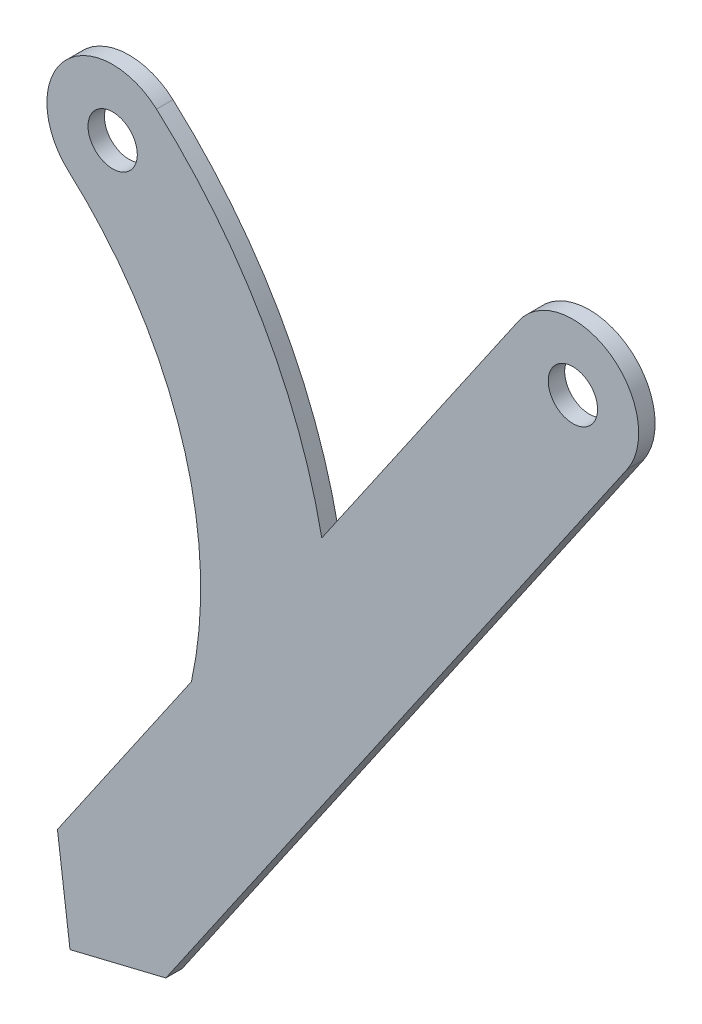
ISO-10303-21;
HEADER;
FILE_DESCRIPTION(('STEP AP214'),'2;1');
FILE_NAME('part.step','',(''),(''),'','','');
FILE_SCHEMA(('AUTOMOTIVE_DESIGN { 1 0 10303 214 1 1 1 1 }'));
ENDSEC;
DATA;
#1=APPLICATION_CONTEXT('core data for automotive mechanical design processes');
#2=APPLICATION_PROTOCOL_DEFINITION('international standard','automotive_design',2000,#1);
#3=PRODUCT_CONTEXT('',#1,'mechanical');
#4=PRODUCT('Part','Part','',(#3));
#5=PRODUCT_RELATED_PRODUCT_CATEGORY('part','',(#4));
#6=PRODUCT_DEFINITION_FORMATION('','',#4);
#7=PRODUCT_DEFINITION_CONTEXT('part definition',#1,'design');
#8=PRODUCT_DEFINITION('design','',#6,#7);
#9=PRODUCT_DEFINITION_SHAPE('','',#8);
#10=(LENGTH_UNIT() NAMED_UNIT(*) SI_UNIT(.MILLI.,.METRE.));
#11=(NAMED_UNIT(*) PLANE_ANGLE_UNIT() SI_UNIT($,.RADIAN.));
#12=(NAMED_UNIT(*) SI_UNIT($,.STERADIAN.) SOLID_ANGLE_UNIT());
#13=UNCERTAINTY_MEASURE_WITH_UNIT(LENGTH_MEASURE(1.E-05),#10,'distance_accuracy_value','');
#14=(GEOMETRIC_REPRESENTATION_CONTEXT(3) GLOBAL_UNCERTAINTY_ASSIGNED_CONTEXT((#13)) GLOBAL_UNIT_ASSIGNED_CONTEXT((#10,
#11,#12)) REPRESENTATION_CONTEXT('',''));
#15=CARTESIAN_POINT('',(0.,0.,0.));
#16=DIRECTION('',(0.,0.,1.));
#17=DIRECTION('',(1.,0.,0.));
#18=AXIS2_PLACEMENT_3D('',#15,#16,#17);
#19=CARTESIAN_POINT('',(18.1283077153022,-75.5243674665704,-1.));
#20=DIRECTION('',(0.236602034156304,-0.971606647482971,0.));
#21=DIRECTION('',(0.971606647482972,0.236602034156304,0.));
#22=AXIS2_PLACEMENT_3D('',#19,#20,#21);
#23=PLANE('',#22);
#24=DIRECTION('',(0.971606647482971,0.236602034156304,0.));
#25=VECTOR('',#24,1.);
#26=CARTESIAN_POINT('',(18.1283077153022,-75.5243674665704,0.));
#27=LINE('',#26,#25);
#28=CARTESIAN_POINT('',(18.1283077153022,-75.5243674665704,0.));
#29=VERTEX_POINT('',#28);
#30=CARTESIAN_POINT('',(23.9579476002001,-74.1047552616325,0.));
#31=VERTEX_POINT('',#30);
#32=EDGE_CURVE('E144',#29,#31,#27,.T.);
#33=ORIENTED_EDGE('',*,*,#32,.F.);
#34=DIRECTION('',(0.,0.,1.));
#35=VECTOR('',#34,1.);
#36=CARTESIAN_POINT('',(18.1283077153022,-75.5243674665704,-1.));
#37=LINE('',#36,#35);
#38=CARTESIAN_POINT('',(18.1283077153022,-75.5243674665704,-1.));
#39=VERTEX_POINT('',#38);
#40=EDGE_CURVE('E11',#39,#29,#37,.T.);
#41=ORIENTED_EDGE('',*,*,#40,.F.);
#42=DIRECTION('',(0.971606647482971,0.236602034156304,0.));
#43=VECTOR('',#42,1.);
#44=CARTESIAN_POINT('',(18.1283077153022,-75.5243674665704,-1.));
#45=LINE('',#44,#43);
#46=CARTESIAN_POINT('',(23.9579476002001,-74.1047552616325,-1.));
#47=VERTEX_POINT('',#46);
#48=EDGE_CURVE('E168',#39,#47,#45,.T.);
#49=ORIENTED_EDGE('',*,*,#48,.T.);
#50=DIRECTION('',(0.,0.,1.));
#51=VECTOR('',#50,1.);
#52=CARTESIAN_POINT('',(23.9579476002001,-74.1047552616325,-1.));
#53=LINE('',#52,#51);
#54=EDGE_CURVE('E44',#47,#31,#53,.T.);
#55=ORIENTED_EDGE('',*,*,#54,.T.);
#56=EDGE_LOOP('',(#33,#41,#49,#55));
#57=FACE_BOUND('',#56,.T.);
#58=ADVANCED_FACE('F41',(#57),#23,.T.);
#59=CARTESIAN_POINT('',(18.1283077153022,-75.5243674665704,-1.));
#60=DIRECTION('',(-0.991879564311857,-0.127180697829984,0.));
#61=DIRECTION('',(0.127180697829984,-0.991879564311857,0.));
#62=AXIS2_PLACEMENT_3D('',#59,#60,#61);
#63=PLANE('',#62);
#64=DIRECTION('',(0.127180697829984,-0.991879564311856,0.));
#65=VECTOR('',#64,1.);
#66=CARTESIAN_POINT('',(18.1283077153022,-75.5243674665704,0.));
#67=LINE('',#66,#65);
#68=CARTESIAN_POINT('',(17.3652235283223,-69.5730900806992,0.));
#69=VERTEX_POINT('',#68);
#70=EDGE_CURVE('E166',#69,#29,#67,.T.);
#71=ORIENTED_EDGE('',*,*,#70,.F.);
#72=DIRECTION('',(0.,0.,1.));
#73=VECTOR('',#72,1.);
#74=CARTESIAN_POINT('',(17.3652235283223,-69.5730900806992,-1.));
#75=LINE('',#74,#73);
#76=CARTESIAN_POINT('',(17.3652235283223,-69.5730900806992,-1.));
#77=VERTEX_POINT('',#76);
#78=EDGE_CURVE('E50',#77,#69,#75,.T.);
#79=ORIENTED_EDGE('',*,*,#78,.F.);
#80=DIRECTION('',(0.127180697829984,-0.991879564311856,0.));
#81=VECTOR('',#80,1.);
#82=CARTESIAN_POINT('',(18.1283077153022,-75.5243674665704,-1.));
#83=LINE('',#82,#81);
#84=EDGE_CURVE('E134',#77,#39,#83,.T.);
#85=ORIENTED_EDGE('',*,*,#84,.T.);
#86=ORIENTED_EDGE('',*,*,#40,.T.);
#87=EDGE_LOOP('',(#71,#79,#85,#86));
#88=FACE_BOUND('',#87,.T.);
#89=ADVANCED_FACE('F182',(#88),#63,.T.);
#90=CARTESIAN_POINT('',(25.5132162915034,-57.7192867032294,-1.));
#91=DIRECTION('',(-0.824090508984721,0.566458147616666,0.));
#92=DIRECTION('',(-0.566458147616666,-0.824090508984721,0.));
#93=AXIS2_PLACEMENT_3D('',#90,#91,#92);
#94=PLANE('',#93);
#95=DIRECTION('',(-0.566458147616666,-0.824090508984721,0.));
#96=VECTOR('',#95,1.);
#97=CARTESIAN_POINT('',(25.5132162915034,-57.7192867032294,0.));
#98=LINE('',#97,#96);
#99=CARTESIAN_POINT('',(25.5132162915034,-57.7192867032294,0.));
#100=VERTEX_POINT('',#99);
#101=EDGE_CURVE('E121',#100,#69,#98,.T.);
#102=ORIENTED_EDGE('',*,*,#101,.F.);
#103=DIRECTION('',(0.,0.,1.));
#104=VECTOR('',#103,1.);
#105=CARTESIAN_POINT('',(25.5132162915034,-57.7192867032294,-1.));
#106=LINE('',#105,#104);
#107=CARTESIAN_POINT('',(25.5132162915034,-57.7192867032294,-1.));
#108=VERTEX_POINT('',#107);
#109=EDGE_CURVE('E116',#108,#100,#106,.T.);
#110=ORIENTED_EDGE('',*,*,#109,.F.);
#111=DIRECTION('',(-0.566458147616666,-0.824090508984721,0.));
#112=VECTOR('',#111,1.);
#113=CARTESIAN_POINT('',(25.5132162915034,-57.7192867032294,-1.));
#114=LINE('',#113,#112);
#115=EDGE_CURVE('E119',#108,#77,#114,.T.);
#116=ORIENTED_EDGE('',*,*,#115,.T.);
#117=ORIENTED_EDGE('',*,*,#78,.T.);
#118=EDGE_LOOP('',(#102,#110,#116,#117));
#119=FACE_BOUND('',#118,.T.);
#120=ADVANCED_FACE('F118',(#119),#94,.T.);
#121=CARTESIAN_POINT('',(1.98443797205253,-52.5323456658369,-1.));
#122=DIRECTION('',(0.,0.,1.));
#123=DIRECTION('',(1.,0.,0.));
#124=AXIS2_PLACEMENT_3D('',#121,#122,#123);
#125=CYLINDRICAL_SURFACE('',#124,24.0937287801462);
#126=CARTESIAN_POINT('',(1.98443797205253,-52.5323456658369,0.));
#127=DIRECTION('',(0.,0.,-1.));
#128=DIRECTION('',(1.,0.,0.));
#129=AXIS2_PLACEMENT_3D('',#126,#127,#128);
#130=CIRCLE('',#129,24.0937287801462);
#131=CARTESIAN_POINT('',(18.0549961293088,-34.5811638928869,0.));
#132=VERTEX_POINT('',#131);
#133=EDGE_CURVE('E163',#132,#100,#130,.T.);
#134=ORIENTED_EDGE('',*,*,#133,.F.);
#135=DIRECTION('',(0.,0.,1.));
#136=VECTOR('',#135,1.);
#137=CARTESIAN_POINT('',(18.0549961293088,-34.5811638928869,-1.));
#138=LINE('',#137,#136);
#139=CARTESIAN_POINT('',(18.0549961293088,-34.5811638928869,-1.));
#140=VERTEX_POINT('',#139);
#141=EDGE_CURVE('E126',#140,#132,#138,.T.);
#142=ORIENTED_EDGE('',*,*,#141,.F.);
#143=CARTESIAN_POINT('',(1.98443797205253,-52.5323456658369,-1.));
#144=DIRECTION('',(0.,0.,-1.));
#145=DIRECTION('',(1.,0.,0.));
#146=AXIS2_PLACEMENT_3D('',#143,#144,#145);
#147=CIRCLE('',#146,24.0937287801462);
#148=EDGE_CURVE('E132',#140,#108,#147,.T.);
#149=ORIENTED_EDGE('',*,*,#148,.T.);
#150=ORIENTED_EDGE('',*,*,#109,.T.);
#151=EDGE_LOOP('',(#134,#142,#149,#150));
#152=FACE_BOUND('',#151,.T.);
#153=ADVANCED_FACE('F136',(#152),#125,.F.);
#154=CARTESIAN_POINT('',(20.7230029461696,-31.6009391320367,-1.));
#155=DIRECTION('',(0.,0.,1.));
#156=DIRECTION('',(1.,0.,0.));
#157=AXIS2_PLACEMENT_3D('',#154,#155,#156);
#158=CYLINDRICAL_SURFACE('',#157,4.);
#159=CARTESIAN_POINT('',(20.7230029461696,-31.6009391320367,0.));
#160=DIRECTION('',(0.,0.,1.));
#161=DIRECTION('',(1.,0.,0.));
#162=AXIS2_PLACEMENT_3D('',#159,#160,#161);
#163=CIRCLE('',#162,4.);
#164=CARTESIAN_POINT('',(23.3910097630304,-28.6207143711865,0.));
#165=VERTEX_POINT('',#164);
#166=EDGE_CURVE('E160',#165,#132,#163,.T.);
#167=ORIENTED_EDGE('',*,*,#166,.F.);
#168=DIRECTION('',(0.,0.,1.));
#169=VECTOR('',#168,1.);
#170=CARTESIAN_POINT('',(23.3910097630304,-28.6207143711865,-1.));
#171=LINE('',#170,#169);
#172=CARTESIAN_POINT('',(23.3910097630304,-28.6207143711865,-1.));
#173=VERTEX_POINT('',#172);
#174=EDGE_CURVE('E172',#173,#165,#171,.T.);
#175=ORIENTED_EDGE('',*,*,#174,.F.);
#176=CARTESIAN_POINT('',(20.7230029461696,-31.6009391320367,-1.));
#177=DIRECTION('',(0.,0.,1.));
#178=DIRECTION('',(1.,0.,0.));
#179=AXIS2_PLACEMENT_3D('',#176,#177,#178);
#180=CIRCLE('',#179,4.);
#181=EDGE_CURVE('E137',#173,#140,#180,.T.);
#182=ORIENTED_EDGE('',*,*,#181,.T.);
#183=ORIENTED_EDGE('',*,*,#141,.T.);
#184=EDGE_LOOP('',(#167,#175,#182,#183));
#185=FACE_BOUND('',#184,.T.);
#186=ADVANCED_FACE('F195',(#185),#158,.T.);
#187=CARTESIAN_POINT('',(1.98443797205253,-52.5323456658369,-1.));
#188=DIRECTION('',(0.,0.,1.));
#189=DIRECTION('',(1.,0.,0.));
#190=AXIS2_PLACEMENT_3D('',#187,#188,#189);
#191=CYLINDRICAL_SURFACE('',#190,32.0937287801462);
#192=CARTESIAN_POINT('',(1.98443797205253,-52.5323456658369,0.));
#193=DIRECTION('',(0.,0.,1.));
#194=DIRECTION('',(1.,0.,0.));
#195=AXIS2_PLACEMENT_3D('',#192,#193,#194);
#196=CIRCLE('',#195,32.0937287801462);
#197=CARTESIAN_POINT('',(33.4436303581367,-46.1820195774433,0.));
#198=VERTEX_POINT('',#197);
#199=EDGE_CURVE('E157',#198,#165,#196,.T.);
#200=ORIENTED_EDGE('',*,*,#199,.F.);
#201=DIRECTION('',(0.,0.,1.));
#202=VECTOR('',#201,1.);
#203=CARTESIAN_POINT('',(33.4436303581367,-46.1820195774433,-1.));
#204=LINE('',#203,#202);
#205=CARTESIAN_POINT('',(33.4436303581367,-46.1820195774433,-1.));
#206=VERTEX_POINT('',#205);
#207=EDGE_CURVE('E174',#206,#198,#204,.T.);
#208=ORIENTED_EDGE('',*,*,#207,.F.);
#209=CARTESIAN_POINT('',(1.98443797205253,-52.5323456658369,-1.));
#210=DIRECTION('',(0.,0.,1.));
#211=DIRECTION('',(1.,0.,0.));
#212=AXIS2_PLACEMENT_3D('',#209,#210,#211);
#213=CIRCLE('',#212,32.0937287801462);
#214=EDGE_CURVE('E139',#206,#173,#213,.T.);
#215=ORIENTED_EDGE('',*,*,#214,.T.);
#216=ORIENTED_EDGE('',*,*,#174,.T.);
#217=EDGE_LOOP('',(#200,#208,#215,#216));
#218=FACE_BOUND('',#217,.T.);
#219=ADVANCED_FACE('F198',(#218),#191,.T.);
#220=CARTESIAN_POINT('',(45.4206856506633,-28.7576473909288,-1.));
#221=DIRECTION('',(-0.824090508984721,0.566458147616665,0.));
#222=DIRECTION('',(-0.566458147616665,-0.824090508984721,0.));
#223=AXIS2_PLACEMENT_3D('',#220,#221,#222);
#224=PLANE('',#223);
#225=DIRECTION('',(-0.566458147616665,-0.824090508984721,0.));
#226=VECTOR('',#225,1.);
#227=CARTESIAN_POINT('',(45.4206856506633,-28.7576473909288,0.));
#228=LINE('',#227,#226);
#229=CARTESIAN_POINT('',(45.4206856506633,-28.7576473909288,0.));
#230=VERTEX_POINT('',#229);
#231=EDGE_CURVE('E154',#230,#198,#228,.T.);
#232=ORIENTED_EDGE('',*,*,#231,.F.);
#233=DIRECTION('',(0.,0.,1.));
#234=VECTOR('',#233,1.);
#235=CARTESIAN_POINT('',(45.4206856506633,-28.7576473909288,-1.));
#236=LINE('',#235,#234);
#237=CARTESIAN_POINT('',(45.4206856506633,-28.7576473909288,-1.));
#238=VERTEX_POINT('',#237);
#239=EDGE_CURVE('E176',#238,#230,#236,.T.);
#240=ORIENTED_EDGE('',*,*,#239,.F.);
#241=DIRECTION('',(-0.566458147616665,-0.824090508984721,0.));
#242=VECTOR('',#241,1.);
#243=CARTESIAN_POINT('',(45.4206856506633,-28.7576473909288,-1.));
#244=LINE('',#243,#242);
#245=EDGE_CURVE('E251',#238,#206,#244,.T.);
#246=ORIENTED_EDGE('',*,*,#245,.T.);
#247=ORIENTED_EDGE('',*,*,#207,.T.);
#248=EDGE_LOOP('',(#232,#240,#246,#247));
#249=FACE_BOUND('',#248,.T.);
#250=ADVANCED_FACE('F202',(#249),#224,.T.);
#251=CARTESIAN_POINT('',(48.7170476866022,-31.0234799813955,-1.));
#252=DIRECTION('',(0.,0.,1.));
#253=DIRECTION('',(1.,0.,0.));
#254=AXIS2_PLACEMENT_3D('',#251,#252,#253);
#255=CYLINDRICAL_SURFACE('',#254,4.);
#256=CARTESIAN_POINT('',(48.7170476866022,-31.0234799813955,0.));
#257=DIRECTION('',(0.,0.,1.));
#258=DIRECTION('',(1.,0.,0.));
#259=AXIS2_PLACEMENT_3D('',#256,#257,#258);
#260=CIRCLE('',#259,4.);
#261=CARTESIAN_POINT('',(52.0134097225411,-33.2893125718621,0.));
#262=VERTEX_POINT('',#261);
#263=EDGE_CURVE('E151',#262,#230,#260,.T.);
#264=ORIENTED_EDGE('',*,*,#263,.F.);
#265=DIRECTION('',(0.,0.,1.));
#266=VECTOR('',#265,1.);
#267=CARTESIAN_POINT('',(52.0134097225411,-33.2893125718621,-1.));
#268=LINE('',#267,#266);
#269=CARTESIAN_POINT('',(52.0134097225411,-33.2893125718621,-1.));
#270=VERTEX_POINT('',#269);
#271=EDGE_CURVE('E177',#270,#262,#268,.T.);
#272=ORIENTED_EDGE('',*,*,#271,.F.);
#273=CARTESIAN_POINT('',(48.7170476866022,-31.0234799813955,-1.));
#274=DIRECTION('',(0.,0.,1.));
#275=DIRECTION('',(1.,0.,0.));
#276=AXIS2_PLACEMENT_3D('',#273,#274,#275);
#277=CIRCLE('',#276,4.);
#278=EDGE_CURVE('E248',#270,#238,#277,.T.);
#279=ORIENTED_EDGE('',*,*,#278,.T.);
#280=ORIENTED_EDGE('',*,*,#239,.T.);
#281=EDGE_LOOP('',(#264,#272,#279,#280));
#282=FACE_BOUND('',#281,.T.);
#283=ADVANCED_FACE('F206',(#282),#255,.T.);
#284=CARTESIAN_POINT('',(52.013409722541,-33.2893125718621,-1.));
#285=DIRECTION('',(0.824090508984721,-0.566458147616666,0.));
#286=DIRECTION('',(0.566458147616666,0.824090508984721,0.));
#287=AXIS2_PLACEMENT_3D('',#284,#285,#286);
#288=PLANE('',#287);
#289=DIRECTION('',(0.566458147616666,0.824090508984721,0.));
#290=VECTOR('',#289,1.);
#291=CARTESIAN_POINT('',(52.013409722541,-33.2893125718621,0.));
#292=LINE('',#291,#290);
#293=EDGE_CURVE('E147',#31,#262,#292,.T.);
#294=ORIENTED_EDGE('',*,*,#293,.F.);
#295=ORIENTED_EDGE('',*,*,#54,.F.);
#296=DIRECTION('',(0.566458147616666,0.824090508984721,0.));
#297=VECTOR('',#296,1.);
#298=CARTESIAN_POINT('',(52.013409722541,-33.2893125718621,-1.));
#299=LINE('',#298,#297);
#300=EDGE_CURVE('E246',#47,#270,#299,.T.);
#301=ORIENTED_EDGE('',*,*,#300,.T.);
#302=ORIENTED_EDGE('',*,*,#271,.T.);
#303=EDGE_LOOP('',(#294,#295,#301,#302));
#304=FACE_BOUND('',#303,.T.);
#305=ADVANCED_FACE('F179',(#304),#288,.T.);
#306=CARTESIAN_POINT('',(48.7170476866022,-31.0234799813955,-1.));
#307=DIRECTION('',(0.,0.,1.));
#308=DIRECTION('',(1.,0.,0.));
#309=AXIS2_PLACEMENT_3D('',#306,#307,#308);
#310=PLANE('',#309);
#311=CARTESIAN_POINT('',(48.7170476866022,-31.0234799813955,-1.));
#312=DIRECTION('',(0.,0.,1.));
#313=DIRECTION('',(1.,0.,0.));
#314=AXIS2_PLACEMENT_3D('',#311,#312,#313);
#315=CIRCLE('',#314,1.5);
#316=CARTESIAN_POINT('',(50.2170476866022,-31.0234799813955,-1.));
#317=VERTEX_POINT('',#316);
#318=EDGE_CURVE('E233',#317,#317,#315,.T.);
#319=ORIENTED_EDGE('',*,*,#318,.T.);
#320=EDGE_LOOP('',(#319));
#321=FACE_BOUND('',#320,.T.);
#322=CARTESIAN_POINT('',(20.7230029461696,-31.6009391320367,-1.));
#323=DIRECTION('',(0.,0.,1.));
#324=DIRECTION('',(1.,0.,0.));
#325=AXIS2_PLACEMENT_3D('',#322,#323,#324);
#326=CIRCLE('',#325,1.50000000000001);
#327=CARTESIAN_POINT('',(22.2230029461696,-31.6009391320367,-1.));
#328=VERTEX_POINT('',#327);
#329=EDGE_CURVE('E148',#328,#328,#326,.T.);
#330=ORIENTED_EDGE('',*,*,#329,.T.);
#331=EDGE_LOOP('',(#330));
#332=FACE_BOUND('',#331,.T.);
#333=ORIENTED_EDGE('',*,*,#48,.F.);
#334=ORIENTED_EDGE('',*,*,#84,.F.);
#335=ORIENTED_EDGE('',*,*,#115,.F.);
#336=ORIENTED_EDGE('',*,*,#148,.F.);
#337=ORIENTED_EDGE('',*,*,#181,.F.);
#338=ORIENTED_EDGE('',*,*,#214,.F.);
#339=ORIENTED_EDGE('',*,*,#245,.F.);
#340=ORIENTED_EDGE('',*,*,#278,.F.);
#341=ORIENTED_EDGE('',*,*,#300,.F.);
#342=EDGE_LOOP('',(#333,#334,#335,#336,#337,#338,#339,#340,#341));
#343=FACE_BOUND('',#342,.T.);
#344=ADVANCED_FACE('F130',(#321,#332,#343),#310,.F.);
#345=CARTESIAN_POINT('',(48.7170476866022,-31.0234799813955,0.));
#346=DIRECTION('',(0.,0.,1.));
#347=DIRECTION('',(1.,0.,0.));
#348=AXIS2_PLACEMENT_3D('',#345,#346,#347);
#349=PLANE('',#348);
#350=CARTESIAN_POINT('',(48.7170476866022,-31.0234799813955,0.));
#351=DIRECTION('',(0.,0.,1.));
#352=DIRECTION('',(1.,0.,0.));
#353=AXIS2_PLACEMENT_3D('',#350,#351,#352);
#354=CIRCLE('',#353,1.5);
#355=CARTESIAN_POINT('',(50.2170476866022,-31.0234799813955,0.));
#356=VERTEX_POINT('',#355);
#357=EDGE_CURVE('E236',#356,#356,#354,.T.);
#358=ORIENTED_EDGE('',*,*,#357,.F.);
#359=EDGE_LOOP('',(#358));
#360=FACE_BOUND('',#359,.T.);
#361=CARTESIAN_POINT('',(20.7230029461696,-31.6009391320367,0.));
#362=DIRECTION('',(0.,0.,1.));
#363=DIRECTION('',(1.,0.,0.));
#364=AXIS2_PLACEMENT_3D('',#361,#362,#363);
#365=CIRCLE('',#364,1.50000000000001);
#366=CARTESIAN_POINT('',(22.2230029461696,-31.6009391320367,0.));
#367=VERTEX_POINT('',#366);
#368=EDGE_CURVE('E238',#367,#367,#365,.T.);
#369=ORIENTED_EDGE('',*,*,#368,.F.);
#370=EDGE_LOOP('',(#369));
#371=FACE_BOUND('',#370,.T.);
#372=ORIENTED_EDGE('',*,*,#32,.T.);
#373=ORIENTED_EDGE('',*,*,#293,.T.);
#374=ORIENTED_EDGE('',*,*,#263,.T.);
#375=ORIENTED_EDGE('',*,*,#231,.T.);
#376=ORIENTED_EDGE('',*,*,#199,.T.);
#377=ORIENTED_EDGE('',*,*,#166,.T.);
#378=ORIENTED_EDGE('',*,*,#133,.T.);
#379=ORIENTED_EDGE('',*,*,#101,.T.);
#380=ORIENTED_EDGE('',*,*,#70,.T.);
#381=EDGE_LOOP('',(#372,#373,#374,#375,#376,#377,#378,#379,#380));
#382=FACE_BOUND('',#381,.T.);
#383=ADVANCED_FACE('F181',(#360,#371,#382),#349,.T.);
#384=CARTESIAN_POINT('',(20.7230029461696,-31.6009391320367,-1.));
#385=DIRECTION('',(0.,0.,1.));
#386=DIRECTION('',(1.,0.,0.));
#387=AXIS2_PLACEMENT_3D('',#384,#385,#386);
#388=CYLINDRICAL_SURFACE('',#387,1.50000000000001);
#389=ORIENTED_EDGE('',*,*,#329,.F.);
#390=EDGE_LOOP('',(#389));
#391=FACE_BOUND('',#390,.T.);
#392=ORIENTED_EDGE('',*,*,#368,.T.);
#393=EDGE_LOOP('',(#392));
#394=FACE_BOUND('',#393,.T.);
#395=ADVANCED_FACE('F218',(#391,#394),#388,.F.);
#396=CARTESIAN_POINT('',(48.7170476866022,-31.0234799813955,-1.));
#397=DIRECTION('',(0.,0.,1.));
#398=DIRECTION('',(1.,0.,0.));
#399=AXIS2_PLACEMENT_3D('',#396,#397,#398);
#400=CYLINDRICAL_SURFACE('',#399,1.5);
#401=ORIENTED_EDGE('',*,*,#318,.F.);
#402=EDGE_LOOP('',(#401));
#403=FACE_BOUND('',#402,.T.);
#404=ORIENTED_EDGE('',*,*,#357,.T.);
#405=EDGE_LOOP('',(#404));
#406=FACE_BOUND('',#405,.T.);
#407=ADVANCED_FACE('F225',(#403,#406),#400,.F.);
#408=CLOSED_SHELL('',(#58,#89,#120,#153,#186,#219,#250,#283,#305,#344,#383,#395,#407));
#409=MANIFOLD_SOLID_BREP('B2',#408);
#410=ADVANCED_BREP_SHAPE_REPRESENTATION('',(#18,#409),#14);
#411=SHAPE_DEFINITION_REPRESENTATION(#9,#410);
ENDSEC;
END-ISO-10303-21;
